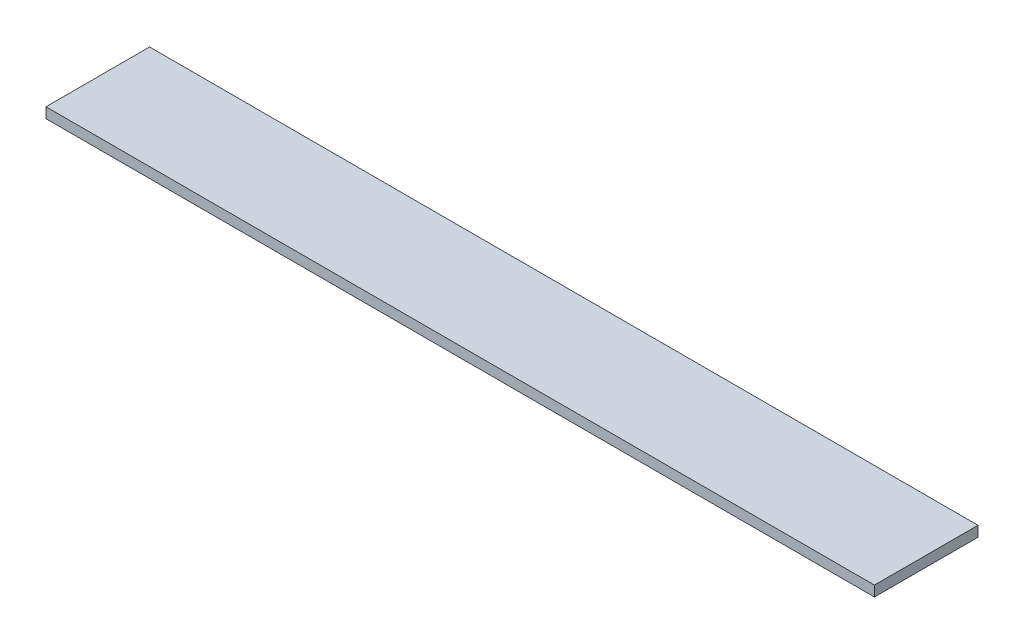
ISO-10303-21;
HEADER;
FILE_DESCRIPTION(('STEP AP214'),'2;1');
FILE_NAME('part.step','',(''),(''),'','','');
FILE_SCHEMA(('AUTOMOTIVE_DESIGN { 1 0 10303 214 1 1 1 1 }'));
ENDSEC;
DATA;
#1=APPLICATION_CONTEXT('core data for automotive mechanical design processes');
#2=APPLICATION_PROTOCOL_DEFINITION('international standard','automotive_design',2000,#1);
#3=PRODUCT_CONTEXT('',#1,'mechanical');
#4=PRODUCT('Part','Part','',(#3));
#5=PRODUCT_RELATED_PRODUCT_CATEGORY('part','',(#4));
#6=PRODUCT_DEFINITION_FORMATION('','',#4);
#7=PRODUCT_DEFINITION_CONTEXT('part definition',#1,'design');
#8=PRODUCT_DEFINITION('design','',#6,#7);
#9=PRODUCT_DEFINITION_SHAPE('','',#8);
#10=(LENGTH_UNIT() NAMED_UNIT(*) SI_UNIT(.MILLI.,.METRE.));
#11=(NAMED_UNIT(*) PLANE_ANGLE_UNIT() SI_UNIT($,.RADIAN.));
#12=(NAMED_UNIT(*) SI_UNIT($,.STERADIAN.) SOLID_ANGLE_UNIT());
#13=UNCERTAINTY_MEASURE_WITH_UNIT(LENGTH_MEASURE(1.E-05),#10,'distance_accuracy_value','');
#14=(GEOMETRIC_REPRESENTATION_CONTEXT(3) GLOBAL_UNCERTAINTY_ASSIGNED_CONTEXT((#13)) GLOBAL_UNIT_ASSIGNED_CONTEXT((#10,
#11,#12)) REPRESENTATION_CONTEXT('',''));
#15=CARTESIAN_POINT('',(0.,0.,0.));
#16=DIRECTION('',(0.,0.,1.));
#17=DIRECTION('',(1.,0.,0.));
#18=AXIS2_PLACEMENT_3D('',#15,#16,#17);
#19=CARTESIAN_POINT('',(0.,2.54,0.));
#20=DIRECTION('',(1.,0.,0.));
#21=DIRECTION('',(0.,0.,-1.));
#22=AXIS2_PLACEMENT_3D('',#19,#20,#21);
#23=PLANE('',#22);
#24=DIRECTION('',(0.,0.,1.));
#25=VECTOR('',#24,1.);
#26=CARTESIAN_POINT('',(0.,0.,0.));
#27=LINE('',#26,#25);
#28=CARTESIAN_POINT('',(0.,0.,-25.4));
#29=VERTEX_POINT('',#28);
#30=CARTESIAN_POINT('',(0.,0.,0.));
#31=VERTEX_POINT('',#30);
#32=EDGE_CURVE('E96',#29,#31,#27,.T.);
#33=ORIENTED_EDGE('',*,*,#32,.T.);
#34=DIRECTION('',(0.,-1.,0.));
#35=VECTOR('',#34,1.);
#36=CARTESIAN_POINT('',(0.,2.54,0.));
#37=LINE('',#36,#35);
#38=CARTESIAN_POINT('',(0.,2.54,0.));
#39=VERTEX_POINT('',#38);
#40=EDGE_CURVE('E11',#39,#31,#37,.T.);
#41=ORIENTED_EDGE('',*,*,#40,.F.);
#42=DIRECTION('',(0.,0.,1.));
#43=VECTOR('',#42,1.);
#44=CARTESIAN_POINT('',(0.,2.54,0.));
#45=LINE('',#44,#43);
#46=CARTESIAN_POINT('',(0.,2.54,-25.4));
#47=VERTEX_POINT('',#46);
#48=EDGE_CURVE('E84',#47,#39,#45,.T.);
#49=ORIENTED_EDGE('',*,*,#48,.F.);
#50=DIRECTION('',(0.,-1.,0.));
#51=VECTOR('',#50,1.);
#52=CARTESIAN_POINT('',(0.,2.54,-25.4));
#53=LINE('',#52,#51);
#54=EDGE_CURVE('E92',#47,#29,#53,.T.);
#55=ORIENTED_EDGE('',*,*,#54,.T.);
#56=EDGE_LOOP('',(#33,#41,#49,#55));
#57=FACE_BOUND('',#56,.T.);
#58=ADVANCED_FACE('F33',(#57),#23,.F.);
#59=CARTESIAN_POINT('',(0.,2.54,0.));
#60=DIRECTION('',(0.,0.,-1.));
#61=DIRECTION('',(-1.,0.,0.));
#62=AXIS2_PLACEMENT_3D('',#59,#60,#61);
#63=PLANE('',#62);
#64=DIRECTION('',(1.,0.,0.));
#65=VECTOR('',#64,1.);
#66=CARTESIAN_POINT('',(0.,0.,0.));
#67=LINE('',#66,#65);
#68=CARTESIAN_POINT('',(203.2,0.,0.));
#69=VERTEX_POINT('',#68);
#70=EDGE_CURVE('E88',#31,#69,#67,.T.);
#71=ORIENTED_EDGE('',*,*,#70,.T.);
#72=DIRECTION('',(0.,-1.,0.));
#73=VECTOR('',#72,1.);
#74=CARTESIAN_POINT('',(203.2,2.54,0.));
#75=LINE('',#74,#73);
#76=CARTESIAN_POINT('',(203.2,2.54,0.));
#77=VERTEX_POINT('',#76);
#78=EDGE_CURVE('E41',#77,#69,#75,.T.);
#79=ORIENTED_EDGE('',*,*,#78,.F.);
#80=DIRECTION('',(1.,0.,0.));
#81=VECTOR('',#80,1.);
#82=CARTESIAN_POINT('',(0.,2.54,0.));
#83=LINE('',#82,#81);
#84=EDGE_CURVE('E79',#39,#77,#83,.T.);
#85=ORIENTED_EDGE('',*,*,#84,.F.);
#86=ORIENTED_EDGE('',*,*,#40,.T.);
#87=EDGE_LOOP('',(#71,#79,#85,#86));
#88=FACE_BOUND('',#87,.T.);
#89=ADVANCED_FACE('F87',(#88),#63,.F.);
#90=CARTESIAN_POINT('',(203.2,2.54,0.));
#91=DIRECTION('',(-1.,0.,0.));
#92=DIRECTION('',(0.,0.,1.));
#93=AXIS2_PLACEMENT_3D('',#90,#91,#92);
#94=PLANE('',#93);
#95=DIRECTION('',(0.,0.,-1.));
#96=VECTOR('',#95,1.);
#97=CARTESIAN_POINT('',(203.2,0.,0.));
#98=LINE('',#97,#96);
#99=CARTESIAN_POINT('',(203.2,0.,-25.4));
#100=VERTEX_POINT('',#99);
#101=EDGE_CURVE('E66',#69,#100,#98,.T.);
#102=ORIENTED_EDGE('',*,*,#101,.T.);
#103=DIRECTION('',(0.,-1.,0.));
#104=VECTOR('',#103,1.);
#105=CARTESIAN_POINT('',(203.2,2.54,-25.4));
#106=LINE('',#105,#104);
#107=CARTESIAN_POINT('',(203.2,2.54,-25.4));
#108=VERTEX_POINT('',#107);
#109=EDGE_CURVE('E89',#108,#100,#106,.T.);
#110=ORIENTED_EDGE('',*,*,#109,.F.);
#111=DIRECTION('',(0.,0.,-1.));
#112=VECTOR('',#111,1.);
#113=CARTESIAN_POINT('',(203.2,2.54,0.));
#114=LINE('',#113,#112);
#115=EDGE_CURVE('E82',#77,#108,#114,.T.);
#116=ORIENTED_EDGE('',*,*,#115,.F.);
#117=ORIENTED_EDGE('',*,*,#78,.T.);
#118=EDGE_LOOP('',(#102,#110,#116,#117));
#119=FACE_BOUND('',#118,.T.);
#120=ADVANCED_FACE('F90',(#119),#94,.F.);
#121=CARTESIAN_POINT('',(0.,2.54,-25.4));
#122=DIRECTION('',(0.,0.,1.));
#123=DIRECTION('',(1.,0.,0.));
#124=AXIS2_PLACEMENT_3D('',#121,#122,#123);
#125=PLANE('',#124);
#126=DIRECTION('',(-1.,0.,0.));
#127=VECTOR('',#126,1.);
#128=CARTESIAN_POINT('',(0.,0.,-25.4));
#129=LINE('',#128,#127);
#130=EDGE_CURVE('E72',#100,#29,#129,.T.);
#131=ORIENTED_EDGE('',*,*,#130,.T.);
#132=ORIENTED_EDGE('',*,*,#54,.F.);
#133=DIRECTION('',(-1.,0.,0.));
#134=VECTOR('',#133,1.);
#135=CARTESIAN_POINT('',(0.,2.54,-25.4));
#136=LINE('',#135,#134);
#137=EDGE_CURVE('E49',#108,#47,#136,.T.);
#138=ORIENTED_EDGE('',*,*,#137,.F.);
#139=ORIENTED_EDGE('',*,*,#109,.T.);
#140=EDGE_LOOP('',(#131,#132,#138,#139));
#141=FACE_BOUND('',#140,.T.);
#142=ADVANCED_FACE('F103',(#141),#125,.F.);
#143=CARTESIAN_POINT('',(0.,2.54,0.));
#144=DIRECTION('',(0.,-1.,0.));
#145=DIRECTION('',(0.,0.,-1.));
#146=AXIS2_PLACEMENT_3D('',#143,#144,#145);
#147=PLANE('',#146);
#148=ORIENTED_EDGE('',*,*,#48,.T.);
#149=ORIENTED_EDGE('',*,*,#84,.T.);
#150=ORIENTED_EDGE('',*,*,#115,.T.);
#151=ORIENTED_EDGE('',*,*,#137,.T.);
#152=EDGE_LOOP('',(#148,#149,#150,#151));
#153=FACE_BOUND('',#152,.T.);
#154=ADVANCED_FACE('F80',(#153),#147,.F.);
#155=CARTESIAN_POINT('',(0.,0.,0.));
#156=DIRECTION('',(0.,-1.,0.));
#157=DIRECTION('',(0.,0.,-1.));
#158=AXIS2_PLACEMENT_3D('',#155,#156,#157);
#159=PLANE('',#158);
#160=ORIENTED_EDGE('',*,*,#32,.F.);
#161=ORIENTED_EDGE('',*,*,#130,.F.);
#162=ORIENTED_EDGE('',*,*,#101,.F.);
#163=ORIENTED_EDGE('',*,*,#70,.F.);
#164=EDGE_LOOP('',(#160,#161,#162,#163));
#165=FACE_BOUND('',#164,.T.);
#166=ADVANCED_FACE('F106',(#165),#159,.T.);
#167=CLOSED_SHELL('',(#58,#89,#120,#142,#154,#166));
#168=MANIFOLD_SOLID_BREP('B2',#167);
#169=ADVANCED_BREP_SHAPE_REPRESENTATION('',(#18,#168),#14);
#170=SHAPE_DEFINITION_REPRESENTATION(#9,#169);
ENDSEC;
END-ISO-10303-21;
